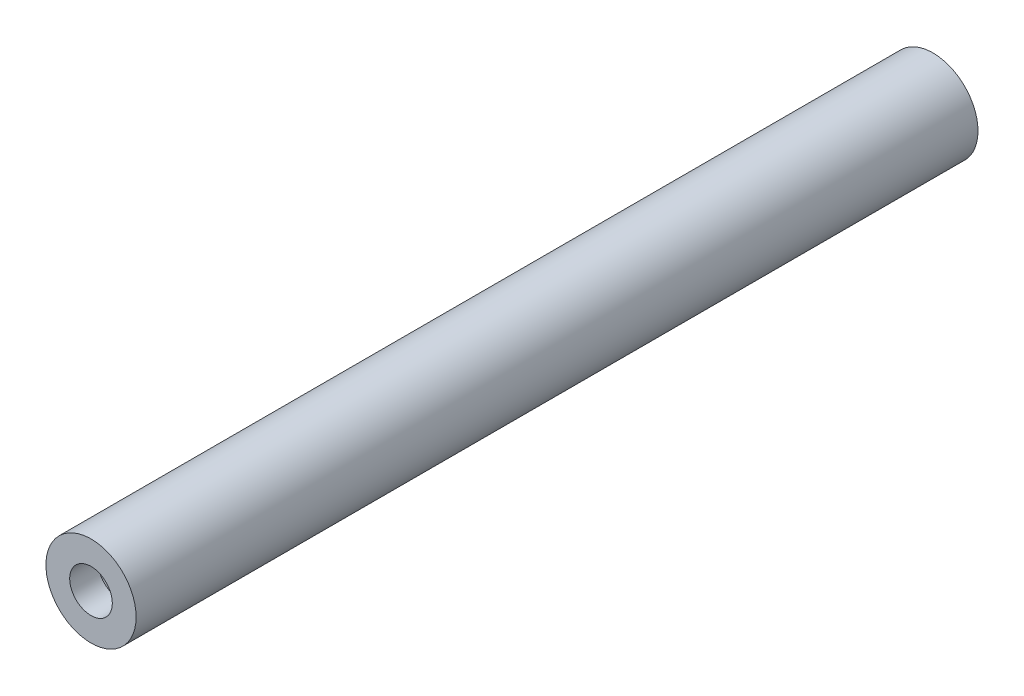
ISO-10303-21;
HEADER;
FILE_DESCRIPTION(('STEP AP214'),'2;1');
FILE_NAME('part.step','',(''),(''),'','','');
FILE_SCHEMA(('AUTOMOTIVE_DESIGN { 1 0 10303 214 1 1 1 1 }'));
ENDSEC;
DATA;
#1=APPLICATION_CONTEXT('core data for automotive mechanical design processes');
#2=APPLICATION_PROTOCOL_DEFINITION('international standard','automotive_design',2000,#1);
#3=PRODUCT_CONTEXT('',#1,'mechanical');
#4=PRODUCT('Part','Part','',(#3));
#5=PRODUCT_RELATED_PRODUCT_CATEGORY('part','',(#4));
#6=PRODUCT_DEFINITION_FORMATION('','',#4);
#7=PRODUCT_DEFINITION_CONTEXT('part definition',#1,'design');
#8=PRODUCT_DEFINITION('design','',#6,#7);
#9=PRODUCT_DEFINITION_SHAPE('','',#8);
#10=(LENGTH_UNIT() NAMED_UNIT(*) SI_UNIT(.MILLI.,.METRE.));
#11=(NAMED_UNIT(*) PLANE_ANGLE_UNIT() SI_UNIT($,.RADIAN.));
#12=(NAMED_UNIT(*) SI_UNIT($,.STERADIAN.) SOLID_ANGLE_UNIT());
#13=UNCERTAINTY_MEASURE_WITH_UNIT(LENGTH_MEASURE(1.E-05),#10,'distance_accuracy_value','');
#14=(GEOMETRIC_REPRESENTATION_CONTEXT(3) GLOBAL_UNCERTAINTY_ASSIGNED_CONTEXT((#13)) GLOBAL_UNIT_ASSIGNED_CONTEXT((#10,
#11,#12)) REPRESENTATION_CONTEXT('',''));
#15=CARTESIAN_POINT('',(0.,0.,0.));
#16=DIRECTION('',(0.,0.,1.));
#17=DIRECTION('',(1.,0.,0.));
#18=AXIS2_PLACEMENT_3D('',#15,#16,#17);
#19=CARTESIAN_POINT('',(0.,0.,-88.9));
#20=DIRECTION('',(0.,0.,1.));
#21=DIRECTION('',(1.,0.,0.));
#22=AXIS2_PLACEMENT_3D('',#19,#20,#21);
#23=CYLINDRICAL_SURFACE('',#22,4.7625);
#24=CARTESIAN_POINT('',(0.,0.,-88.9));
#25=DIRECTION('',(0.,0.,1.));
#26=DIRECTION('',(1.,0.,0.));
#27=AXIS2_PLACEMENT_3D('',#24,#25,#26);
#28=CIRCLE('',#27,4.7625);
#29=CARTESIAN_POINT('',(4.7625,0.,-88.9));
#30=VERTEX_POINT('',#29);
#31=EDGE_CURVE('E10',#30,#30,#28,.T.);
#32=ORIENTED_EDGE('',*,*,#31,.T.);
#33=EDGE_LOOP('',(#32));
#34=FACE_BOUND('',#33,.T.);
#35=CARTESIAN_POINT('',(0.,0.,0.));
#36=DIRECTION('',(0.,0.,1.));
#37=DIRECTION('',(1.,0.,0.));
#38=AXIS2_PLACEMENT_3D('',#35,#36,#37);
#39=CIRCLE('',#38,4.7625);
#40=CARTESIAN_POINT('',(4.7625,0.,0.));
#41=VERTEX_POINT('',#40);
#42=EDGE_CURVE('E34',#41,#41,#39,.T.);
#43=ORIENTED_EDGE('',*,*,#42,.F.);
#44=EDGE_LOOP('',(#43));
#45=FACE_BOUND('',#44,.T.);
#46=ADVANCED_FACE('F31',(#34,#45),#23,.T.);
#47=CARTESIAN_POINT('',(0.,0.,-88.9));
#48=DIRECTION('',(0.,0.,1.));
#49=DIRECTION('',(1.,0.,0.));
#50=AXIS2_PLACEMENT_3D('',#47,#48,#49);
#51=PLANE('',#50);
#52=ORIENTED_EDGE('',*,*,#31,.F.);
#53=EDGE_LOOP('',(#52));
#54=FACE_BOUND('',#53,.T.);
#55=ADVANCED_FACE('F60',(#54),#51,.F.);
#56=CARTESIAN_POINT('',(0.,0.,0.));
#57=DIRECTION('',(0.,0.,1.));
#58=DIRECTION('',(1.,0.,0.));
#59=AXIS2_PLACEMENT_3D('',#56,#57,#58);
#60=PLANE('',#59);
#61=CARTESIAN_POINT('',(0.,0.,0.));
#62=DIRECTION('',(0.,0.,1.));
#63=DIRECTION('',(1.,0.,0.));
#64=AXIS2_PLACEMENT_3D('',#61,#62,#63);
#65=CIRCLE('',#64,2.25);
#66=CARTESIAN_POINT('',(2.25,0.,0.));
#67=VERTEX_POINT('',#66);
#68=EDGE_CURVE('E43',#67,#67,#65,.T.);
#69=ORIENTED_EDGE('',*,*,#68,.F.);
#70=EDGE_LOOP('',(#69));
#71=FACE_BOUND('',#70,.T.);
#72=ORIENTED_EDGE('',*,*,#42,.T.);
#73=EDGE_LOOP('',(#72));
#74=FACE_BOUND('',#73,.T.);
#75=ADVANCED_FACE('F54',(#71,#74),#60,.T.);
#76=CARTESIAN_POINT('',(0.,0.,-3.));
#77=DIRECTION('',(0.,0.,1.));
#78=DIRECTION('',(1.,0.,0.));
#79=AXIS2_PLACEMENT_3D('',#76,#77,#78);
#80=CYLINDRICAL_SURFACE('',#79,2.25);
#81=CARTESIAN_POINT('',(0.,0.,-3.));
#82=DIRECTION('',(0.,0.,1.));
#83=DIRECTION('',(1.,0.,0.));
#84=AXIS2_PLACEMENT_3D('',#81,#82,#83);
#85=CIRCLE('',#84,2.25);
#86=CARTESIAN_POINT('',(2.25,0.,-3.));
#87=VERTEX_POINT('',#86);
#88=EDGE_CURVE('E41',#87,#87,#85,.T.);
#89=ORIENTED_EDGE('',*,*,#88,.F.);
#90=EDGE_LOOP('',(#89));
#91=FACE_BOUND('',#90,.T.);
#92=ORIENTED_EDGE('',*,*,#68,.T.);
#93=EDGE_LOOP('',(#92));
#94=FACE_BOUND('',#93,.T.);
#95=ADVANCED_FACE('F51',(#91,#94),#80,.F.);
#96=CARTESIAN_POINT('',(0.,0.,-3.));
#97=DIRECTION('',(0.,0.,1.));
#98=DIRECTION('',(1.,0.,0.));
#99=AXIS2_PLACEMENT_3D('',#96,#97,#98);
#100=PLANE('',#99);
#101=ORIENTED_EDGE('',*,*,#88,.T.);
#102=EDGE_LOOP('',(#101));
#103=FACE_BOUND('',#102,.T.);
#104=ADVANCED_FACE('F49',(#103),#100,.T.);
#105=CLOSED_SHELL('',(#46,#55,#75,#95,#104));
#106=MANIFOLD_SOLID_BREP('B2',#105);
#107=ADVANCED_BREP_SHAPE_REPRESENTATION('',(#18,#106),#14);
#108=SHAPE_DEFINITION_REPRESENTATION(#9,#107);
ENDSEC;
END-ISO-10303-21;
